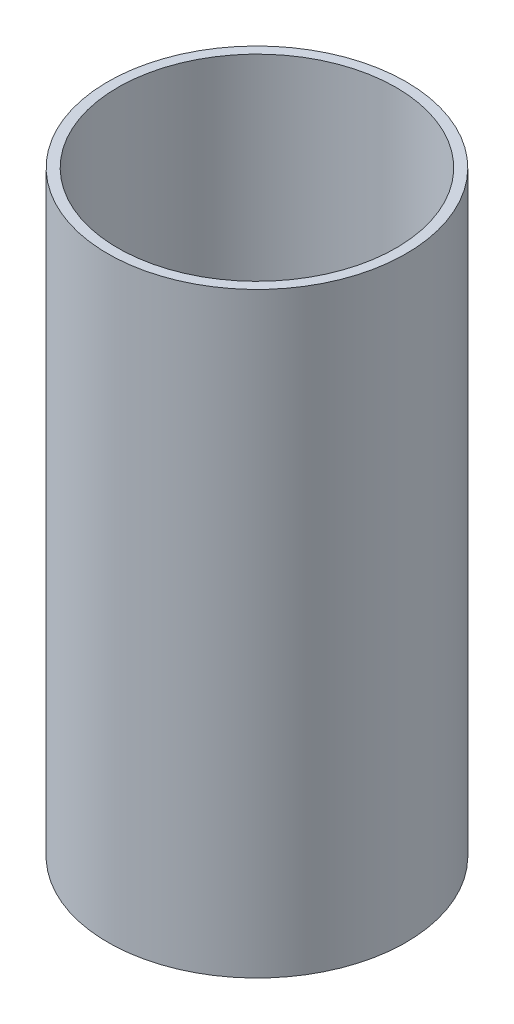
ISO-10303-21;
HEADER;
FILE_DESCRIPTION(('STEP AP214'),'2;1');
FILE_NAME('part.step','',(''),(''),'','','');
FILE_SCHEMA(('AUTOMOTIVE_DESIGN { 1 0 10303 214 1 1 1 1 }'));
ENDSEC;
DATA;
#1=APPLICATION_CONTEXT('core data for automotive mechanical design processes');
#2=APPLICATION_PROTOCOL_DEFINITION('international standard','automotive_design',2000,#1);
#3=PRODUCT_CONTEXT('',#1,'mechanical');
#4=PRODUCT('Part','Part','',(#3));
#5=PRODUCT_RELATED_PRODUCT_CATEGORY('part','',(#4));
#6=PRODUCT_DEFINITION_FORMATION('','',#4);
#7=PRODUCT_DEFINITION_CONTEXT('part definition',#1,'design');
#8=PRODUCT_DEFINITION('design','',#6,#7);
#9=PRODUCT_DEFINITION_SHAPE('','',#8);
#10=(LENGTH_UNIT() NAMED_UNIT(*) SI_UNIT(.MILLI.,.METRE.));
#11=(NAMED_UNIT(*) PLANE_ANGLE_UNIT() SI_UNIT($,.RADIAN.));
#12=(NAMED_UNIT(*) SI_UNIT($,.STERADIAN.) SOLID_ANGLE_UNIT());
#13=UNCERTAINTY_MEASURE_WITH_UNIT(LENGTH_MEASURE(1.E-05),#10,'distance_accuracy_value','');
#14=(GEOMETRIC_REPRESENTATION_CONTEXT(3) GLOBAL_UNCERTAINTY_ASSIGNED_CONTEXT((#13)) GLOBAL_UNIT_ASSIGNED_CONTEXT((#10,
#11,#12)) REPRESENTATION_CONTEXT('',''));
#15=CARTESIAN_POINT('',(0.,0.,0.));
#16=DIRECTION('',(0.,0.,1.));
#17=DIRECTION('',(1.,0.,0.));
#18=AXIS2_PLACEMENT_3D('',#15,#16,#17);
#19=CARTESIAN_POINT('',(0.,90.,0.));
#20=DIRECTION('',(0.,1.,0.));
#21=DIRECTION('',(0.,0.,1.));
#22=AXIS2_PLACEMENT_3D('',#19,#20,#21);
#23=PLANE('',#22);
#24=CARTESIAN_POINT('',(0.,90.,0.));
#25=DIRECTION('',(0.,1.,0.));
#26=DIRECTION('',(0.,0.,1.));
#27=AXIS2_PLACEMENT_3D('',#24,#25,#26);
#28=CIRCLE('',#27,22.5);
#29=CARTESIAN_POINT('',(0.,90.,-22.5));
#30=VERTEX_POINT('',#29);
#31=EDGE_CURVE('E10',#30,#30,#28,.T.);
#32=ORIENTED_EDGE('',*,*,#31,.T.);
#33=EDGE_LOOP('',(#32));
#34=FACE_BOUND('',#33,.T.);
#35=CARTESIAN_POINT('',(0.,90.,0.));
#36=DIRECTION('',(0.,1.,0.));
#37=DIRECTION('',(0.,0.,1.));
#38=AXIS2_PLACEMENT_3D('',#35,#36,#37);
#39=CIRCLE('',#38,21.);
#40=CARTESIAN_POINT('',(0.,90.,-21.));
#41=VERTEX_POINT('',#40);
#42=EDGE_CURVE('E50',#41,#41,#39,.T.);
#43=ORIENTED_EDGE('',*,*,#42,.F.);
#44=EDGE_LOOP('',(#43));
#45=FACE_BOUND('',#44,.T.);
#46=ADVANCED_FACE('F37',(#34,#45),#23,.T.);
#47=CARTESIAN_POINT('',(0.,0.,0.));
#48=DIRECTION('',(0.,1.,0.));
#49=DIRECTION('',(0.,0.,1.));
#50=AXIS2_PLACEMENT_3D('',#47,#48,#49);
#51=PLANE('',#50);
#52=CARTESIAN_POINT('',(0.,0.,0.));
#53=DIRECTION('',(0.,1.,0.));
#54=DIRECTION('',(0.,0.,1.));
#55=AXIS2_PLACEMENT_3D('',#52,#53,#54);
#56=CIRCLE('',#55,22.5);
#57=CARTESIAN_POINT('',(0.,0.,-22.5));
#58=VERTEX_POINT('',#57);
#59=EDGE_CURVE('E41',#58,#58,#56,.T.);
#60=ORIENTED_EDGE('',*,*,#59,.F.);
#61=EDGE_LOOP('',(#60));
#62=FACE_BOUND('',#61,.T.);
#63=CARTESIAN_POINT('',(0.,0.,0.));
#64=DIRECTION('',(0.,1.,0.));
#65=DIRECTION('',(0.,0.,1.));
#66=AXIS2_PLACEMENT_3D('',#63,#64,#65);
#67=CIRCLE('',#66,21.);
#68=CARTESIAN_POINT('',(0.,0.,-21.));
#69=VERTEX_POINT('',#68);
#70=EDGE_CURVE('E52',#69,#69,#67,.T.);
#71=ORIENTED_EDGE('',*,*,#70,.T.);
#72=EDGE_LOOP('',(#71));
#73=FACE_BOUND('',#72,.T.);
#74=ADVANCED_FACE('F64',(#62,#73),#51,.F.);
#75=CARTESIAN_POINT('',(0.,90.,0.));
#76=DIRECTION('',(0.,-1.,0.));
#77=DIRECTION('',(0.,0.,-1.));
#78=AXIS2_PLACEMENT_3D('',#75,#76,#77);
#79=CYLINDRICAL_SURFACE('',#78,22.5);
#80=CARTESIAN_POINT('',(0.,90.,-22.5));
#81=CARTESIAN_POINT('',(0.,89.0625,-22.5));
#82=CARTESIAN_POINT('',(0.,88.125,-22.5));
#83=CARTESIAN_POINT('',(0.,86.25,-22.5));
#84=CARTESIAN_POINT('',(0.,85.3125,-22.5));
#85=CARTESIAN_POINT('',(0.,83.4375,-22.5));
#86=CARTESIAN_POINT('',(0.,82.5,-22.5));
#87=CARTESIAN_POINT('',(0.,80.625,-22.5));
#88=CARTESIAN_POINT('',(0.,79.6875,-22.5));
#89=CARTESIAN_POINT('',(0.,77.8125,-22.5));
#90=CARTESIAN_POINT('',(0.,76.875,-22.5));
#91=CARTESIAN_POINT('',(0.,75.,-22.5));
#92=CARTESIAN_POINT('',(0.,74.0625,-22.5));
#93=CARTESIAN_POINT('',(0.,72.1875,-22.5));
#94=CARTESIAN_POINT('',(0.,71.25,-22.5));
#95=CARTESIAN_POINT('',(0.,69.375,-22.5));
#96=CARTESIAN_POINT('',(0.,68.4375,-22.5));
#97=CARTESIAN_POINT('',(0.,66.5625,-22.5));
#98=CARTESIAN_POINT('',(0.,65.625,-22.5));
#99=CARTESIAN_POINT('',(0.,63.75,-22.5));
#100=CARTESIAN_POINT('',(0.,62.8125,-22.5));
#101=CARTESIAN_POINT('',(0.,60.9375,-22.5));
#102=CARTESIAN_POINT('',(0.,60.,-22.5));
#103=CARTESIAN_POINT('',(0.,58.125,-22.5));
#104=CARTESIAN_POINT('',(0.,57.1875,-22.5));
#105=CARTESIAN_POINT('',(0.,55.3125,-22.5));
#106=CARTESIAN_POINT('',(0.,54.375,-22.5));
#107=CARTESIAN_POINT('',(0.,52.5,-22.5));
#108=CARTESIAN_POINT('',(0.,51.5625,-22.5));
#109=CARTESIAN_POINT('',(0.,49.6875,-22.5));
#110=CARTESIAN_POINT('',(0.,48.75,-22.5));
#111=CARTESIAN_POINT('',(0.,46.875,-22.5));
#112=CARTESIAN_POINT('',(0.,45.9375,-22.5));
#113=CARTESIAN_POINT('',(0.,44.0625,-22.5));
#114=CARTESIAN_POINT('',(0.,43.125,-22.5));
#115=CARTESIAN_POINT('',(0.,41.25,-22.5));
#116=CARTESIAN_POINT('',(0.,40.3125,-22.5));
#117=CARTESIAN_POINT('',(0.,38.4375,-22.5));
#118=CARTESIAN_POINT('',(0.,37.5,-22.5));
#119=CARTESIAN_POINT('',(0.,35.625,-22.5));
#120=CARTESIAN_POINT('',(0.,34.6875,-22.5));
#121=CARTESIAN_POINT('',(0.,32.8125,-22.5));
#122=CARTESIAN_POINT('',(0.,31.875,-22.5));
#123=CARTESIAN_POINT('',(0.,30.,-22.5));
#124=CARTESIAN_POINT('',(0.,29.0625,-22.5));
#125=CARTESIAN_POINT('',(0.,27.1875,-22.5));
#126=CARTESIAN_POINT('',(0.,26.25,-22.5));
#127=CARTESIAN_POINT('',(0.,24.375,-22.5));
#128=CARTESIAN_POINT('',(0.,23.4375,-22.5));
#129=CARTESIAN_POINT('',(0.,21.5625,-22.5));
#130=CARTESIAN_POINT('',(0.,20.625,-22.5));
#131=CARTESIAN_POINT('',(0.,18.75,-22.5));
#132=CARTESIAN_POINT('',(0.,17.8125,-22.5));
#133=CARTESIAN_POINT('',(0.,15.9375,-22.5));
#134=CARTESIAN_POINT('',(0.,15.,-22.5));
#135=CARTESIAN_POINT('',(0.,13.125,-22.5));
#136=CARTESIAN_POINT('',(0.,12.1875,-22.5));
#137=CARTESIAN_POINT('',(0.,10.3125,-22.5));
#138=CARTESIAN_POINT('',(0.,9.37499999999999,-22.5));
#139=CARTESIAN_POINT('',(0.,7.49999999999999,-22.5));
#140=CARTESIAN_POINT('',(0.,6.56249999999999,-22.5));
#141=CARTESIAN_POINT('',(0.,4.68749999999999,-22.5));
#142=CARTESIAN_POINT('',(0.,3.74999999999998,-22.5));
#143=CARTESIAN_POINT('',(0.,1.87499999999998,-22.5));
#144=CARTESIAN_POINT('',(0.,0.937499999999986,-22.5));
#145=CARTESIAN_POINT('',(0.,0.,-22.5));
#146=B_SPLINE_CURVE_WITH_KNOTS('',3,(#80,#81,#82,#83,#84,#85,#86,#87,#88,#89,#90,#91,#92,#93,
#94,#95,#96,#97,#98,#99,#100,#101,#102,#103,#104,#105,#106,#107,#108,#109,#110,#111,#112,#113,
#114,#115,#116,#117,#118,#119,#120,#121,#122,#123,#124,#125,#126,#127,#128,#129,#130,#131,#132,
#133,#134,#135,#136,#137,#138,#139,#140,#141,#142,#143,#144,#145),.UNSPECIFIED.,.F.,.F.,(4,2,2,
2,2,2,2,2,2,2,2,2,2,2,2,2,2,2,2,2,2,2,2,2,2,2,2,2,2,2,2,2,4),(0.,2.8125,5.62499999999999,
8.43749999999999,11.25,14.0625,16.875,19.6875,22.5,25.3125,28.125,30.9375,33.75,36.5625,39.375,
42.1875,45.,47.8125,50.625,53.4375,56.25,59.0625,61.875,64.6875,67.5,70.3125,73.125,75.9375,
78.75,81.5625,84.375,87.1875,90.),.UNSPECIFIED.);
#147=EDGE_CURVE('BSEAM39',#30,#58,#146,.T.);
#148=ORIENTED_EDGE('',*,*,#31,.F.);
#149=ORIENTED_EDGE('',*,*,#59,.T.);
#150=ORIENTED_EDGE('',*,*,#147,.T.);
#151=ORIENTED_EDGE('',*,*,#147,.F.);
#152=EDGE_LOOP('',(#148,#150,#149,#151));
#153=FACE_BOUND('',#152,.T.);
#154=ADVANCED_FACE('F39',(#153),#79,.T.);
#155=CARTESIAN_POINT('',(0.,90.,0.));
#156=DIRECTION('',(0.,-1.,0.));
#157=DIRECTION('',(0.,0.,-1.));
#158=AXIS2_PLACEMENT_3D('',#155,#156,#157);
#159=CYLINDRICAL_SURFACE('',#158,21.);
#160=CARTESIAN_POINT('',(0.,90.,-21.));
#161=CARTESIAN_POINT('',(0.,89.0625,-21.));
#162=CARTESIAN_POINT('',(0.,88.125,-21.));
#163=CARTESIAN_POINT('',(0.,86.25,-21.));
#164=CARTESIAN_POINT('',(0.,85.3125,-21.));
#165=CARTESIAN_POINT('',(0.,83.4375,-21.));
#166=CARTESIAN_POINT('',(0.,82.5,-21.));
#167=CARTESIAN_POINT('',(0.,80.625,-21.));
#168=CARTESIAN_POINT('',(0.,79.6875,-21.));
#169=CARTESIAN_POINT('',(0.,77.8125,-21.));
#170=CARTESIAN_POINT('',(0.,76.875,-21.));
#171=CARTESIAN_POINT('',(0.,75.,-21.));
#172=CARTESIAN_POINT('',(0.,74.0625,-21.));
#173=CARTESIAN_POINT('',(0.,72.1875,-21.));
#174=CARTESIAN_POINT('',(0.,71.25,-21.));
#175=CARTESIAN_POINT('',(0.,69.375,-21.));
#176=CARTESIAN_POINT('',(0.,68.4375,-21.));
#177=CARTESIAN_POINT('',(0.,66.5625,-21.));
#178=CARTESIAN_POINT('',(0.,65.625,-21.));
#179=CARTESIAN_POINT('',(0.,63.75,-21.));
#180=CARTESIAN_POINT('',(0.,62.8125,-21.));
#181=CARTESIAN_POINT('',(0.,60.9375,-21.));
#182=CARTESIAN_POINT('',(0.,60.,-21.));
#183=CARTESIAN_POINT('',(0.,58.125,-21.));
#184=CARTESIAN_POINT('',(0.,57.1875,-21.));
#185=CARTESIAN_POINT('',(0.,55.3125,-21.));
#186=CARTESIAN_POINT('',(0.,54.375,-21.));
#187=CARTESIAN_POINT('',(0.,52.5,-21.));
#188=CARTESIAN_POINT('',(0.,51.5625,-21.));
#189=CARTESIAN_POINT('',(0.,49.6875,-21.));
#190=CARTESIAN_POINT('',(0.,48.75,-21.));
#191=CARTESIAN_POINT('',(0.,46.875,-21.));
#192=CARTESIAN_POINT('',(0.,45.9375,-21.));
#193=CARTESIAN_POINT('',(0.,44.0625,-21.));
#194=CARTESIAN_POINT('',(0.,43.125,-21.));
#195=CARTESIAN_POINT('',(0.,41.25,-21.));
#196=CARTESIAN_POINT('',(0.,40.3125,-21.));
#197=CARTESIAN_POINT('',(0.,38.4375,-21.));
#198=CARTESIAN_POINT('',(0.,37.5,-21.));
#199=CARTESIAN_POINT('',(0.,35.625,-21.));
#200=CARTESIAN_POINT('',(0.,34.6875,-21.));
#201=CARTESIAN_POINT('',(0.,32.8125,-21.));
#202=CARTESIAN_POINT('',(0.,31.875,-21.));
#203=CARTESIAN_POINT('',(0.,30.,-21.));
#204=CARTESIAN_POINT('',(0.,29.0625,-21.));
#205=CARTESIAN_POINT('',(0.,27.1875,-21.));
#206=CARTESIAN_POINT('',(0.,26.25,-21.));
#207=CARTESIAN_POINT('',(0.,24.375,-21.));
#208=CARTESIAN_POINT('',(0.,23.4375,-21.));
#209=CARTESIAN_POINT('',(0.,21.5625,-21.));
#210=CARTESIAN_POINT('',(0.,20.625,-21.));
#211=CARTESIAN_POINT('',(0.,18.75,-21.));
#212=CARTESIAN_POINT('',(0.,17.8125,-21.));
#213=CARTESIAN_POINT('',(0.,15.9375,-21.));
#214=CARTESIAN_POINT('',(0.,15.,-21.));
#215=CARTESIAN_POINT('',(0.,13.125,-21.));
#216=CARTESIAN_POINT('',(0.,12.1875,-21.));
#217=CARTESIAN_POINT('',(0.,10.3125,-21.));
#218=CARTESIAN_POINT('',(0.,9.37499999999999,-21.));
#219=CARTESIAN_POINT('',(0.,7.49999999999999,-21.));
#220=CARTESIAN_POINT('',(0.,6.56249999999999,-21.));
#221=CARTESIAN_POINT('',(0.,4.68749999999999,-21.));
#222=CARTESIAN_POINT('',(0.,3.74999999999998,-21.));
#223=CARTESIAN_POINT('',(0.,1.87499999999998,-21.));
#224=CARTESIAN_POINT('',(0.,0.937499999999986,-21.));
#225=CARTESIAN_POINT('',(0.,0.,-21.));
#226=B_SPLINE_CURVE_WITH_KNOTS('',3,(#160,#161,#162,#163,#164,#165,#166,#167,#168,#169,#170,
#171,#172,#173,#174,#175,#176,#177,#178,#179,#180,#181,#182,#183,#184,#185,#186,#187,#188,#189,
#190,#191,#192,#193,#194,#195,#196,#197,#198,#199,#200,#201,#202,#203,#204,#205,#206,#207,#208,
#209,#210,#211,#212,#213,#214,#215,#216,#217,#218,#219,#220,#221,#222,#223,#224,#225),
.UNSPECIFIED.,.F.,.F.,(4,2,2,2,2,2,2,2,2,2,2,2,2,2,2,2,2,2,2,2,2,2,2,2,2,2,2,2,2,2,2,2,4),(0.,
2.8125,5.62499999999999,8.43749999999999,11.25,14.0625,16.875,19.6875,22.5,25.3125,28.125,
30.9375,33.75,36.5625,39.375,42.1875,45.,47.8125,50.625,53.4375,56.25,59.0625,61.875,64.6875,
67.5,70.3125,73.125,75.9375,78.75,81.5625,84.375,87.1875,90.),.UNSPECIFIED.);
#227=EDGE_CURVE('BSEAM60',#41,#69,#226,.T.);
#228=ORIENTED_EDGE('',*,*,#42,.T.);
#229=ORIENTED_EDGE('',*,*,#70,.F.);
#230=ORIENTED_EDGE('',*,*,#227,.T.);
#231=ORIENTED_EDGE('',*,*,#227,.F.);
#232=EDGE_LOOP('',(#228,#230,#229,#231));
#233=FACE_BOUND('',#232,.T.);
#234=ADVANCED_FACE('F60',(#233),#159,.F.);
#235=CLOSED_SHELL('',(#46,#74,#154,#234));
#236=MANIFOLD_SOLID_BREP('B2',#235);
#237=ADVANCED_BREP_SHAPE_REPRESENTATION('',(#18,#236),#14);
#238=SHAPE_DEFINITION_REPRESENTATION(#9,#237);
ENDSEC;
END-ISO-10303-21;
